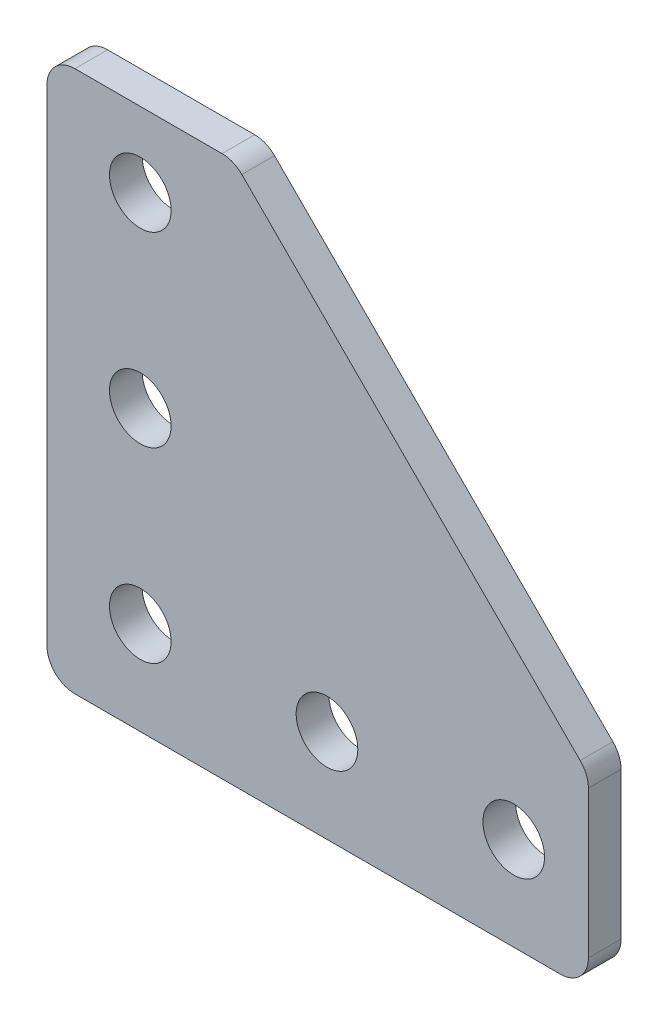
ISO-10303-21;
HEADER;
FILE_DESCRIPTION(('STEP AP214'),'2;1');
FILE_NAME('part.step','',(''),(''),'','','');
FILE_SCHEMA(('AUTOMOTIVE_DESIGN { 1 0 10303 214 1 1 1 1 }'));
ENDSEC;
DATA;
#1=APPLICATION_CONTEXT('core data for automotive mechanical design processes');
#2=APPLICATION_PROTOCOL_DEFINITION('international standard','automotive_design',2000,#1);
#3=PRODUCT_CONTEXT('',#1,'mechanical');
#4=PRODUCT('Part','Part','',(#3));
#5=PRODUCT_RELATED_PRODUCT_CATEGORY('part','',(#4));
#6=PRODUCT_DEFINITION_FORMATION('','',#4);
#7=PRODUCT_DEFINITION_CONTEXT('part definition',#1,'design');
#8=PRODUCT_DEFINITION('design','',#6,#7);
#9=PRODUCT_DEFINITION_SHAPE('','',#8);
#10=(LENGTH_UNIT() NAMED_UNIT(*) SI_UNIT(.MILLI.,.METRE.));
#11=(NAMED_UNIT(*) PLANE_ANGLE_UNIT() SI_UNIT($,.RADIAN.));
#12=(NAMED_UNIT(*) SI_UNIT($,.STERADIAN.) SOLID_ANGLE_UNIT());
#13=UNCERTAINTY_MEASURE_WITH_UNIT(LENGTH_MEASURE(1.E-05),#10,'distance_accuracy_value','');
#14=(GEOMETRIC_REPRESENTATION_CONTEXT(3) GLOBAL_UNCERTAINTY_ASSIGNED_CONTEXT((#13)) GLOBAL_UNIT_ASSIGNED_CONTEXT((#10,
#11,#12)) REPRESENTATION_CONTEXT('',''));
#15=CARTESIAN_POINT('',(0.,0.,0.));
#16=DIRECTION('',(0.,0.,1.));
#17=DIRECTION('',(1.,0.,0.));
#18=AXIS2_PLACEMENT_3D('',#15,#16,#17);
#19=CARTESIAN_POINT('',(29.,0.,1.75));
#20=DIRECTION('',(1.,0.,0.));
#21=DIRECTION('',(0.,1.,0.));
#22=AXIS2_PLACEMENT_3D('',#19,#20,#21);
#23=PLANE('',#22);
#24=DIRECTION('',(0.,-1.,0.));
#25=VECTOR('',#24,1.);
#26=CARTESIAN_POINT('',(29.,0.,-1.75));
#27=LINE('',#26,#25);
#28=CARTESIAN_POINT('',(29.,-10.2426406871193,-1.75));
#29=VERTEX_POINT('',#28);
#30=CARTESIAN_POINT('',(29.,-26.,-1.75));
#31=VERTEX_POINT('',#30);
#32=EDGE_CURVE('E185',#29,#31,#27,.T.);
#33=ORIENTED_EDGE('',*,*,#32,.F.);
#34=DIRECTION('',(0.,0.,-1.));
#35=VECTOR('',#34,1.);
#36=CARTESIAN_POINT('',(29.,-10.2426406871193,1.75));
#37=LINE('',#36,#35);
#38=CARTESIAN_POINT('',(29.,-10.2426406871193,1.75));
#39=VERTEX_POINT('',#38);
#40=EDGE_CURVE('E170',#29,#39,#37,.F.);
#41=ORIENTED_EDGE('',*,*,#40,.T.);
#42=DIRECTION('',(0.,-1.,0.));
#43=VECTOR('',#42,1.);
#44=CARTESIAN_POINT('',(29.,0.,1.75));
#45=LINE('',#44,#43);
#46=CARTESIAN_POINT('',(29.,-26.,1.75));
#47=VERTEX_POINT('',#46);
#48=EDGE_CURVE('E190',#39,#47,#45,.T.);
#49=ORIENTED_EDGE('',*,*,#48,.T.);
#50=DIRECTION('',(0.,0.,-1.));
#51=VECTOR('',#50,1.);
#52=CARTESIAN_POINT('',(29.,-26.,-1.75));
#53=LINE('',#52,#51);
#54=EDGE_CURVE('E167',#47,#31,#53,.T.);
#55=ORIENTED_EDGE('',*,*,#54,.T.);
#56=EDGE_LOOP('',(#33,#41,#49,#55));
#57=FACE_BOUND('',#56,.T.);
#58=ADVANCED_FACE('F36',(#57),#23,.T.);
#59=CARTESIAN_POINT('',(10.,10.,1.75));
#60=DIRECTION('',(0.707106781186547,0.707106781186547,0.));
#61=DIRECTION('',(-0.707106781186548,0.707106781186548,0.));
#62=AXIS2_PLACEMENT_3D('',#59,#60,#61);
#63=PLANE('',#62);
#64=DIRECTION('',(0.707106781186548,-0.707106781186548,0.));
#65=VECTOR('',#64,1.);
#66=CARTESIAN_POINT('',(10.,10.,-1.75));
#67=LINE('',#66,#65);
#68=CARTESIAN_POINT('',(-8.12132034355965,28.1213203435597,-1.75));
#69=VERTEX_POINT('',#68);
#70=CARTESIAN_POINT('',(28.1213203435597,-8.12132034355964,-1.75));
#71=VERTEX_POINT('',#70);
#72=EDGE_CURVE('E134',#69,#71,#67,.T.);
#73=ORIENTED_EDGE('',*,*,#72,.F.);
#74=DIRECTION('',(0.,0.,-1.));
#75=VECTOR('',#74,1.);
#76=CARTESIAN_POINT('',(-8.12132034355964,28.1213203435597,1.75));
#77=LINE('',#76,#75);
#78=CARTESIAN_POINT('',(-8.12132034355965,28.1213203435597,1.75));
#79=VERTEX_POINT('',#78);
#80=EDGE_CURVE('E157',#69,#79,#77,.F.);
#81=ORIENTED_EDGE('',*,*,#80,.T.);
#82=DIRECTION('',(0.707106781186548,-0.707106781186548,0.));
#83=VECTOR('',#82,1.);
#84=CARTESIAN_POINT('',(10.,10.,1.75));
#85=LINE('',#84,#83);
#86=CARTESIAN_POINT('',(28.1213203435597,-8.12132034355964,1.75));
#87=VERTEX_POINT('',#86);
#88=EDGE_CURVE('E181',#79,#87,#85,.T.);
#89=ORIENTED_EDGE('',*,*,#88,.T.);
#90=DIRECTION('',(0.,0.,-1.));
#91=VECTOR('',#90,1.);
#92=CARTESIAN_POINT('',(28.1213203435597,-8.12132034355963,1.75));
#93=LINE('',#92,#91);
#94=EDGE_CURVE('E154',#87,#71,#93,.T.);
#95=ORIENTED_EDGE('',*,*,#94,.T.);
#96=EDGE_LOOP('',(#73,#81,#89,#95));
#97=FACE_BOUND('',#96,.T.);
#98=ADVANCED_FACE('F259',(#97),#63,.T.);
#99=CARTESIAN_POINT('',(0.,29.,1.75));
#100=DIRECTION('',(0.,1.,0.));
#101=DIRECTION('',(0.,0.,1.));
#102=AXIS2_PLACEMENT_3D('',#99,#100,#101);
#103=PLANE('',#102);
#104=DIRECTION('',(1.,0.,0.));
#105=VECTOR('',#104,1.);
#106=CARTESIAN_POINT('',(0.,29.,1.75));
#107=LINE('',#106,#105);
#108=CARTESIAN_POINT('',(-26.,29.,1.75));
#109=VERTEX_POINT('',#108);
#110=CARTESIAN_POINT('',(-10.2426406871193,29.,1.75));
#111=VERTEX_POINT('',#110);
#112=EDGE_CURVE('E179',#109,#111,#107,.T.);
#113=ORIENTED_EDGE('',*,*,#112,.T.);
#114=DIRECTION('',(0.,0.,-1.));
#115=VECTOR('',#114,1.);
#116=CARTESIAN_POINT('',(-10.2426406871193,29.,1.75));
#117=LINE('',#116,#115);
#118=CARTESIAN_POINT('',(-10.2426406871193,29.,-1.75));
#119=VERTEX_POINT('',#118);
#120=EDGE_CURVE('E125',#111,#119,#117,.T.);
#121=ORIENTED_EDGE('',*,*,#120,.T.);
#122=DIRECTION('',(1.,0.,0.));
#123=VECTOR('',#122,1.);
#124=CARTESIAN_POINT('',(0.,29.,-1.75));
#125=LINE('',#124,#123);
#126=CARTESIAN_POINT('',(-26.,29.,-1.75));
#127=VERTEX_POINT('',#126);
#128=EDGE_CURVE('E117',#127,#119,#125,.T.);
#129=ORIENTED_EDGE('',*,*,#128,.F.);
#130=DIRECTION('',(0.,0.,-1.));
#131=VECTOR('',#130,1.);
#132=CARTESIAN_POINT('',(-26.,29.,1.75));
#133=LINE('',#132,#131);
#134=EDGE_CURVE('E131',#127,#109,#133,.F.);
#135=ORIENTED_EDGE('',*,*,#134,.T.);
#136=EDGE_LOOP('',(#113,#121,#129,#135));
#137=FACE_BOUND('',#136,.T.);
#138=ADVANCED_FACE('F130',(#137),#103,.T.);
#139=CARTESIAN_POINT('',(-29.,0.,1.75));
#140=DIRECTION('',(1.,0.,0.));
#141=DIRECTION('',(0.,1.,0.));
#142=AXIS2_PLACEMENT_3D('',#139,#140,#141);
#143=PLANE('',#142);
#144=DIRECTION('',(0.,-1.,0.));
#145=VECTOR('',#144,1.);
#146=CARTESIAN_POINT('',(-29.,0.,-1.75));
#147=LINE('',#146,#145);
#148=CARTESIAN_POINT('',(-29.,26.,-1.75));
#149=VERTEX_POINT('',#148);
#150=CARTESIAN_POINT('',(-29.,-26.,-1.75));
#151=VERTEX_POINT('',#150);
#152=EDGE_CURVE('E119',#149,#151,#147,.T.);
#153=ORIENTED_EDGE('',*,*,#152,.T.);
#154=DIRECTION('',(0.,0.,-1.));
#155=VECTOR('',#154,1.);
#156=CARTESIAN_POINT('',(-29.,-26.,1.75));
#157=LINE('',#156,#155);
#158=CARTESIAN_POINT('',(-29.,-26.,1.75));
#159=VERTEX_POINT('',#158);
#160=EDGE_CURVE('E11',#151,#159,#157,.F.);
#161=ORIENTED_EDGE('',*,*,#160,.T.);
#162=DIRECTION('',(0.,-1.,0.));
#163=VECTOR('',#162,1.);
#164=CARTESIAN_POINT('',(-29.,0.,1.75));
#165=LINE('',#164,#163);
#166=CARTESIAN_POINT('',(-29.,26.,1.75));
#167=VERTEX_POINT('',#166);
#168=EDGE_CURVE('E141',#167,#159,#165,.T.);
#169=ORIENTED_EDGE('',*,*,#168,.F.);
#170=DIRECTION('',(0.,0.,-1.));
#171=VECTOR('',#170,1.);
#172=CARTESIAN_POINT('',(-29.,26.,-1.75));
#173=LINE('',#172,#171);
#174=EDGE_CURVE('E44',#167,#149,#173,.T.);
#175=ORIENTED_EDGE('',*,*,#174,.T.);
#176=EDGE_LOOP('',(#153,#161,#169,#175));
#177=FACE_BOUND('',#176,.T.);
#178=ADVANCED_FACE('F177',(#177),#143,.F.);
#179=CARTESIAN_POINT('',(0.,-29.,1.75));
#180=DIRECTION('',(0.,1.,0.));
#181=DIRECTION('',(0.,0.,1.));
#182=AXIS2_PLACEMENT_3D('',#179,#180,#181);
#183=PLANE('',#182);
#184=DIRECTION('',(1.,0.,0.));
#185=VECTOR('',#184,1.);
#186=CARTESIAN_POINT('',(0.,-29.,-1.75));
#187=LINE('',#186,#185);
#188=CARTESIAN_POINT('',(-26.,-29.,-1.75));
#189=VERTEX_POINT('',#188);
#190=CARTESIAN_POINT('',(26.,-29.,-1.75));
#191=VERTEX_POINT('',#190);
#192=EDGE_CURVE('E144',#189,#191,#187,.T.);
#193=ORIENTED_EDGE('',*,*,#192,.T.);
#194=DIRECTION('',(0.,0.,-1.));
#195=VECTOR('',#194,1.);
#196=CARTESIAN_POINT('',(26.,-29.,1.75));
#197=LINE('',#196,#195);
#198=CARTESIAN_POINT('',(26.,-29.,1.75));
#199=VERTEX_POINT('',#198);
#200=EDGE_CURVE('E51',#191,#199,#197,.F.);
#201=ORIENTED_EDGE('',*,*,#200,.T.);
#202=DIRECTION('',(1.,0.,0.));
#203=VECTOR('',#202,1.);
#204=CARTESIAN_POINT('',(0.,-29.,1.75));
#205=LINE('',#204,#203);
#206=CARTESIAN_POINT('',(-26.,-29.,1.75));
#207=VERTEX_POINT('',#206);
#208=EDGE_CURVE('E138',#207,#199,#205,.T.);
#209=ORIENTED_EDGE('',*,*,#208,.F.);
#210=DIRECTION('',(0.,0.,-1.));
#211=VECTOR('',#210,1.);
#212=CARTESIAN_POINT('',(-26.,-29.,1.75));
#213=LINE('',#212,#211);
#214=EDGE_CURVE('E172',#207,#189,#213,.T.);
#215=ORIENTED_EDGE('',*,*,#214,.T.);
#216=EDGE_LOOP('',(#193,#201,#209,#215));
#217=FACE_BOUND('',#216,.T.);
#218=ADVANCED_FACE('F242',(#217),#183,.F.);
#219=CARTESIAN_POINT('',(0.,0.,1.75));
#220=DIRECTION('',(0.,0.,1.));
#221=DIRECTION('',(1.,0.,0.));
#222=AXIS2_PLACEMENT_3D('',#219,#220,#221);
#223=PLANE('',#222);
#224=CARTESIAN_POINT('',(0.999999999999994,-19.,1.75));
#225=DIRECTION('',(0.,0.,1.));
#226=DIRECTION('',(1.,0.,0.));
#227=AXIS2_PLACEMENT_3D('',#224,#225,#226);
#228=CIRCLE('',#227,3.3);
#229=CARTESIAN_POINT('',(4.29999999999999,-19.,1.75));
#230=VERTEX_POINT('',#229);
#231=EDGE_CURVE('E223',#230,#230,#228,.T.);
#232=ORIENTED_EDGE('',*,*,#231,.F.);
#233=EDGE_LOOP('',(#232));
#234=FACE_BOUND('',#233,.T.);
#235=CARTESIAN_POINT('',(21.,-19.,1.75));
#236=DIRECTION('',(0.,0.,1.));
#237=DIRECTION('',(1.,0.,0.));
#238=AXIS2_PLACEMENT_3D('',#235,#236,#237);
#239=CIRCLE('',#238,3.3);
#240=CARTESIAN_POINT('',(24.3,-19.,1.75));
#241=VERTEX_POINT('',#240);
#242=EDGE_CURVE('E217',#241,#241,#239,.T.);
#243=ORIENTED_EDGE('',*,*,#242,.F.);
#244=EDGE_LOOP('',(#243));
#245=FACE_BOUND('',#244,.T.);
#246=CARTESIAN_POINT('',(-19.0000000000001,1.00000000000001,1.75));
#247=DIRECTION('',(0.,0.,1.));
#248=DIRECTION('',(1.,0.,0.));
#249=AXIS2_PLACEMENT_3D('',#246,#247,#248);
#250=CIRCLE('',#249,3.3);
#251=CARTESIAN_POINT('',(-15.7000000000001,1.00000000000001,1.75));
#252=VERTEX_POINT('',#251);
#253=EDGE_CURVE('E211',#252,#252,#250,.T.);
#254=ORIENTED_EDGE('',*,*,#253,.F.);
#255=EDGE_LOOP('',(#254));
#256=FACE_BOUND('',#255,.T.);
#257=CARTESIAN_POINT('',(-19.0000000000001,21.,1.75));
#258=DIRECTION('',(0.,0.,1.));
#259=DIRECTION('',(1.,0.,0.));
#260=AXIS2_PLACEMENT_3D('',#257,#258,#259);
#261=CIRCLE('',#260,3.3);
#262=CARTESIAN_POINT('',(-15.7000000000001,21.,1.75));
#263=VERTEX_POINT('',#262);
#264=EDGE_CURVE('E205',#263,#263,#261,.T.);
#265=ORIENTED_EDGE('',*,*,#264,.F.);
#266=EDGE_LOOP('',(#265));
#267=FACE_BOUND('',#266,.T.);
#268=CARTESIAN_POINT('',(-19.,-19.,1.75));
#269=DIRECTION('',(0.,0.,1.));
#270=DIRECTION('',(1.,0.,0.));
#271=AXIS2_PLACEMENT_3D('',#268,#269,#270);
#272=CIRCLE('',#271,3.3);
#273=CARTESIAN_POINT('',(-15.7,-19.,1.75));
#274=VERTEX_POINT('',#273);
#275=EDGE_CURVE('E199',#274,#274,#272,.T.);
#276=ORIENTED_EDGE('',*,*,#275,.F.);
#277=EDGE_LOOP('',(#276));
#278=FACE_BOUND('',#277,.T.);
#279=ORIENTED_EDGE('',*,*,#88,.F.);
#280=CARTESIAN_POINT('',(-10.2426406871193,26.,1.75));
#281=DIRECTION('',(0.,0.,1.));
#282=DIRECTION('',(1.,0.,0.));
#283=AXIS2_PLACEMENT_3D('',#280,#281,#282);
#284=CIRCLE('',#283,3.);
#285=EDGE_CURVE('E165',#79,#111,#284,.T.);
#286=ORIENTED_EDGE('',*,*,#285,.T.);
#287=ORIENTED_EDGE('',*,*,#112,.F.);
#288=CARTESIAN_POINT('',(-26.,26.,1.75));
#289=DIRECTION('',(0.,0.,1.));
#290=DIRECTION('',(1.,0.,0.));
#291=AXIS2_PLACEMENT_3D('',#288,#289,#290);
#292=CIRCLE('',#291,3.);
#293=EDGE_CURVE('E137',#109,#167,#292,.T.);
#294=ORIENTED_EDGE('',*,*,#293,.T.);
#295=ORIENTED_EDGE('',*,*,#168,.T.);
#296=CARTESIAN_POINT('',(-26.,-26.,1.75));
#297=DIRECTION('',(0.,0.,1.));
#298=DIRECTION('',(1.,0.,0.));
#299=AXIS2_PLACEMENT_3D('',#296,#297,#298);
#300=CIRCLE('',#299,3.);
#301=EDGE_CURVE('E58',#159,#207,#300,.T.);
#302=ORIENTED_EDGE('',*,*,#301,.T.);
#303=ORIENTED_EDGE('',*,*,#208,.T.);
#304=CARTESIAN_POINT('',(26.,-26.,1.75));
#305=DIRECTION('',(0.,0.,1.));
#306=DIRECTION('',(1.,0.,0.));
#307=AXIS2_PLACEMENT_3D('',#304,#305,#306);
#308=CIRCLE('',#307,3.);
#309=EDGE_CURVE('E161',#199,#47,#308,.T.);
#310=ORIENTED_EDGE('',*,*,#309,.T.);
#311=ORIENTED_EDGE('',*,*,#48,.F.);
#312=CARTESIAN_POINT('',(26.,-10.2426406871193,1.75));
#313=DIRECTION('',(0.,0.,1.));
#314=DIRECTION('',(1.,0.,0.));
#315=AXIS2_PLACEMENT_3D('',#312,#313,#314);
#316=CIRCLE('',#315,3.);
#317=EDGE_CURVE('E163',#39,#87,#316,.T.);
#318=ORIENTED_EDGE('',*,*,#317,.T.);
#319=EDGE_LOOP('',(#279,#286,#287,#294,#295,#302,#303,#310,#311,#318));
#320=FACE_BOUND('',#319,.T.);
#321=ADVANCED_FACE('F239',(#234,#245,#256,#267,#278,#320),#223,.T.);
#322=CARTESIAN_POINT('',(0.,0.,-1.75));
#323=DIRECTION('',(0.,0.,1.));
#324=DIRECTION('',(1.,0.,0.));
#325=AXIS2_PLACEMENT_3D('',#322,#323,#324);
#326=PLANE('',#325);
#327=CARTESIAN_POINT('',(0.999999999999994,-19.,-1.75));
#328=DIRECTION('',(0.,0.,1.));
#329=DIRECTION('',(1.,0.,0.));
#330=AXIS2_PLACEMENT_3D('',#327,#328,#329);
#331=CIRCLE('',#330,3.3);
#332=CARTESIAN_POINT('',(4.29999999999999,-19.,-1.75));
#333=VERTEX_POINT('',#332);
#334=EDGE_CURVE('E202',#333,#333,#331,.T.);
#335=ORIENTED_EDGE('',*,*,#334,.T.);
#336=EDGE_LOOP('',(#335));
#337=FACE_BOUND('',#336,.T.);
#338=CARTESIAN_POINT('',(21.,-19.,-1.75));
#339=DIRECTION('',(0.,0.,1.));
#340=DIRECTION('',(1.,0.,0.));
#341=AXIS2_PLACEMENT_3D('',#338,#339,#340);
#342=CIRCLE('',#341,3.3);
#343=CARTESIAN_POINT('',(24.3,-19.,-1.75));
#344=VERTEX_POINT('',#343);
#345=EDGE_CURVE('E220',#344,#344,#342,.T.);
#346=ORIENTED_EDGE('',*,*,#345,.T.);
#347=EDGE_LOOP('',(#346));
#348=FACE_BOUND('',#347,.T.);
#349=CARTESIAN_POINT('',(-19.0000000000001,1.00000000000001,-1.75));
#350=DIRECTION('',(0.,0.,1.));
#351=DIRECTION('',(1.,0.,0.));
#352=AXIS2_PLACEMENT_3D('',#349,#350,#351);
#353=CIRCLE('',#352,3.3);
#354=CARTESIAN_POINT('',(-15.7000000000001,1.00000000000001,-1.75));
#355=VERTEX_POINT('',#354);
#356=EDGE_CURVE('E214',#355,#355,#353,.T.);
#357=ORIENTED_EDGE('',*,*,#356,.T.);
#358=EDGE_LOOP('',(#357));
#359=FACE_BOUND('',#358,.T.);
#360=CARTESIAN_POINT('',(-19.0000000000001,21.,-1.75));
#361=DIRECTION('',(0.,0.,1.));
#362=DIRECTION('',(1.,0.,0.));
#363=AXIS2_PLACEMENT_3D('',#360,#361,#362);
#364=CIRCLE('',#363,3.3);
#365=CARTESIAN_POINT('',(-15.7000000000001,21.,-1.75));
#366=VERTEX_POINT('',#365);
#367=EDGE_CURVE('E208',#366,#366,#364,.T.);
#368=ORIENTED_EDGE('',*,*,#367,.T.);
#369=EDGE_LOOP('',(#368));
#370=FACE_BOUND('',#369,.T.);
#371=CARTESIAN_POINT('',(-19.,-19.,-1.75));
#372=DIRECTION('',(0.,0.,1.));
#373=DIRECTION('',(1.,0.,0.));
#374=AXIS2_PLACEMENT_3D('',#371,#372,#373);
#375=CIRCLE('',#374,3.3);
#376=CARTESIAN_POINT('',(-15.7,-19.,-1.75));
#377=VERTEX_POINT('',#376);
#378=EDGE_CURVE('E188',#377,#377,#375,.T.);
#379=ORIENTED_EDGE('',*,*,#378,.T.);
#380=EDGE_LOOP('',(#379));
#381=FACE_BOUND('',#380,.T.);
#382=ORIENTED_EDGE('',*,*,#128,.T.);
#383=CARTESIAN_POINT('',(-10.2426406871193,26.,-1.75));
#384=DIRECTION('',(0.,0.,1.));
#385=DIRECTION('',(1.,0.,0.));
#386=AXIS2_PLACEMENT_3D('',#383,#384,#385);
#387=CIRCLE('',#386,3.);
#388=EDGE_CURVE('E152',#119,#69,#387,.F.);
#389=ORIENTED_EDGE('',*,*,#388,.T.);
#390=ORIENTED_EDGE('',*,*,#72,.T.);
#391=CARTESIAN_POINT('',(26.,-10.2426406871193,-1.75));
#392=DIRECTION('',(0.,0.,1.));
#393=DIRECTION('',(1.,0.,0.));
#394=AXIS2_PLACEMENT_3D('',#391,#392,#393);
#395=CIRCLE('',#394,3.);
#396=EDGE_CURVE('E150',#71,#29,#395,.F.);
#397=ORIENTED_EDGE('',*,*,#396,.T.);
#398=ORIENTED_EDGE('',*,*,#32,.T.);
#399=CARTESIAN_POINT('',(26.,-26.,-1.75));
#400=DIRECTION('',(0.,0.,1.));
#401=DIRECTION('',(1.,0.,0.));
#402=AXIS2_PLACEMENT_3D('',#399,#400,#401);
#403=CIRCLE('',#402,3.);
#404=EDGE_CURVE('E148',#31,#191,#403,.F.);
#405=ORIENTED_EDGE('',*,*,#404,.T.);
#406=ORIENTED_EDGE('',*,*,#192,.F.);
#407=CARTESIAN_POINT('',(-26.,-26.,-1.75));
#408=DIRECTION('',(0.,0.,1.));
#409=DIRECTION('',(1.,0.,0.));
#410=AXIS2_PLACEMENT_3D('',#407,#408,#409);
#411=CIRCLE('',#410,3.);
#412=EDGE_CURVE('E124',#189,#151,#411,.F.);
#413=ORIENTED_EDGE('',*,*,#412,.T.);
#414=ORIENTED_EDGE('',*,*,#152,.F.);
#415=CARTESIAN_POINT('',(-26.,26.,-1.75));
#416=DIRECTION('',(0.,0.,1.));
#417=DIRECTION('',(1.,0.,0.));
#418=AXIS2_PLACEMENT_3D('',#415,#416,#417);
#419=CIRCLE('',#418,3.);
#420=EDGE_CURVE('E114',#149,#127,#419,.F.);
#421=ORIENTED_EDGE('',*,*,#420,.T.);
#422=EDGE_LOOP('',(#382,#389,#390,#397,#398,#405,#406,#413,#414,#421));
#423=FACE_BOUND('',#422,.T.);
#424=ADVANCED_FACE('F116',(#337,#348,#359,#370,#381,#423),#326,.F.);
#425=CARTESIAN_POINT('',(-19.,-19.,-1.75));
#426=DIRECTION('',(0.,0.,1.));
#427=DIRECTION('',(1.,0.,0.));
#428=AXIS2_PLACEMENT_3D('',#425,#426,#427);
#429=CYLINDRICAL_SURFACE('',#428,3.3);
#430=ORIENTED_EDGE('',*,*,#378,.F.);
#431=EDGE_LOOP('',(#430));
#432=FACE_BOUND('',#431,.T.);
#433=ORIENTED_EDGE('',*,*,#275,.T.);
#434=EDGE_LOOP('',(#433));
#435=FACE_BOUND('',#434,.T.);
#436=ADVANCED_FACE('F328',(#432,#435),#429,.F.);
#437=CARTESIAN_POINT('',(-19.0000000000001,21.,-1.75));
#438=DIRECTION('',(0.,0.,1.));
#439=DIRECTION('',(1.,0.,0.));
#440=AXIS2_PLACEMENT_3D('',#437,#438,#439);
#441=CYLINDRICAL_SURFACE('',#440,3.3);
#442=ORIENTED_EDGE('',*,*,#367,.F.);
#443=EDGE_LOOP('',(#442));
#444=FACE_BOUND('',#443,.T.);
#445=ORIENTED_EDGE('',*,*,#264,.T.);
#446=EDGE_LOOP('',(#445));
#447=FACE_BOUND('',#446,.T.);
#448=ADVANCED_FACE('F386',(#444,#447),#441,.F.);
#449=CARTESIAN_POINT('',(-19.0000000000001,1.00000000000001,-1.75));
#450=DIRECTION('',(0.,0.,1.));
#451=DIRECTION('',(1.,0.,0.));
#452=AXIS2_PLACEMENT_3D('',#449,#450,#451);
#453=CYLINDRICAL_SURFACE('',#452,3.3);
#454=ORIENTED_EDGE('',*,*,#356,.F.);
#455=EDGE_LOOP('',(#454));
#456=FACE_BOUND('',#455,.T.);
#457=ORIENTED_EDGE('',*,*,#253,.T.);
#458=EDGE_LOOP('',(#457));
#459=FACE_BOUND('',#458,.T.);
#460=ADVANCED_FACE('F376',(#456,#459),#453,.F.);
#461=CARTESIAN_POINT('',(21.,-19.,-1.75));
#462=DIRECTION('',(0.,0.,1.));
#463=DIRECTION('',(1.,0.,0.));
#464=AXIS2_PLACEMENT_3D('',#461,#462,#463);
#465=CYLINDRICAL_SURFACE('',#464,3.3);
#466=ORIENTED_EDGE('',*,*,#345,.F.);
#467=EDGE_LOOP('',(#466));
#468=FACE_BOUND('',#467,.T.);
#469=ORIENTED_EDGE('',*,*,#242,.T.);
#470=EDGE_LOOP('',(#469));
#471=FACE_BOUND('',#470,.T.);
#472=ADVANCED_FACE('F235',(#468,#471),#465,.F.);
#473=CARTESIAN_POINT('',(0.999999999999994,-19.,-1.75));
#474=DIRECTION('',(0.,0.,1.));
#475=DIRECTION('',(1.,0.,0.));
#476=AXIS2_PLACEMENT_3D('',#473,#474,#475);
#477=CYLINDRICAL_SURFACE('',#476,3.3);
#478=ORIENTED_EDGE('',*,*,#334,.F.);
#479=EDGE_LOOP('',(#478));
#480=FACE_BOUND('',#479,.T.);
#481=ORIENTED_EDGE('',*,*,#231,.T.);
#482=EDGE_LOOP('',(#481));
#483=FACE_BOUND('',#482,.T.);
#484=ADVANCED_FACE('F231',(#480,#483),#477,.F.);
#485=CARTESIAN_POINT('',(-10.2426406871193,26.,1.75));
#486=DIRECTION('',(0.,0.,-1.));
#487=DIRECTION('',(-1.,0.,0.));
#488=AXIS2_PLACEMENT_3D('',#485,#486,#487);
#489=CYLINDRICAL_SURFACE('',#488,3.);
#490=ORIENTED_EDGE('',*,*,#285,.F.);
#491=ORIENTED_EDGE('',*,*,#80,.F.);
#492=ORIENTED_EDGE('',*,*,#388,.F.);
#493=ORIENTED_EDGE('',*,*,#120,.F.);
#494=EDGE_LOOP('',(#490,#491,#492,#493));
#495=FACE_BOUND('',#494,.T.);
#496=ADVANCED_FACE('F234',(#495),#489,.T.);
#497=CARTESIAN_POINT('',(26.,-10.2426406871193,1.75));
#498=DIRECTION('',(0.,0.,-1.));
#499=DIRECTION('',(-1.,0.,0.));
#500=AXIS2_PLACEMENT_3D('',#497,#498,#499);
#501=CYLINDRICAL_SURFACE('',#500,3.);
#502=ORIENTED_EDGE('',*,*,#317,.F.);
#503=ORIENTED_EDGE('',*,*,#40,.F.);
#504=ORIENTED_EDGE('',*,*,#396,.F.);
#505=ORIENTED_EDGE('',*,*,#94,.F.);
#506=EDGE_LOOP('',(#502,#503,#504,#505));
#507=FACE_BOUND('',#506,.T.);
#508=ADVANCED_FACE('F261',(#507),#501,.T.);
#509=CARTESIAN_POINT('',(26.,-26.,1.75));
#510=DIRECTION('',(0.,0.,1.));
#511=DIRECTION('',(1.,0.,0.));
#512=AXIS2_PLACEMENT_3D('',#509,#510,#511);
#513=CYLINDRICAL_SURFACE('',#512,3.);
#514=ORIENTED_EDGE('',*,*,#309,.F.);
#515=ORIENTED_EDGE('',*,*,#200,.F.);
#516=ORIENTED_EDGE('',*,*,#404,.F.);
#517=ORIENTED_EDGE('',*,*,#54,.F.);
#518=EDGE_LOOP('',(#514,#515,#516,#517));
#519=FACE_BOUND('',#518,.T.);
#520=ADVANCED_FACE('F266',(#519),#513,.T.);
#521=CARTESIAN_POINT('',(-26.,-26.,1.75));
#522=DIRECTION('',(0.,0.,-1.));
#523=DIRECTION('',(-1.,0.,0.));
#524=AXIS2_PLACEMENT_3D('',#521,#522,#523);
#525=CYLINDRICAL_SURFACE('',#524,3.);
#526=ORIENTED_EDGE('',*,*,#301,.F.);
#527=ORIENTED_EDGE('',*,*,#160,.F.);
#528=ORIENTED_EDGE('',*,*,#412,.F.);
#529=ORIENTED_EDGE('',*,*,#214,.F.);
#530=EDGE_LOOP('',(#526,#527,#528,#529));
#531=FACE_BOUND('',#530,.T.);
#532=ADVANCED_FACE('F269',(#531),#525,.T.);
#533=CARTESIAN_POINT('',(-26.,26.,1.75));
#534=DIRECTION('',(0.,0.,1.));
#535=DIRECTION('',(1.,0.,0.));
#536=AXIS2_PLACEMENT_3D('',#533,#534,#535);
#537=CYLINDRICAL_SURFACE('',#536,3.);
#538=ORIENTED_EDGE('',*,*,#293,.F.);
#539=ORIENTED_EDGE('',*,*,#134,.F.);
#540=ORIENTED_EDGE('',*,*,#420,.F.);
#541=ORIENTED_EDGE('',*,*,#174,.F.);
#542=EDGE_LOOP('',(#538,#539,#540,#541));
#543=FACE_BOUND('',#542,.T.);
#544=ADVANCED_FACE('F38',(#543),#537,.T.);
#545=CLOSED_SHELL('',(#58,#98,#138,#178,#218,#321,#424,#436,#448,#460,#472,#484,#496,#508,#520,
#532,#544));
#546=MANIFOLD_SOLID_BREP('B2',#545);
#547=ADVANCED_BREP_SHAPE_REPRESENTATION('',(#18,#546),#14);
#548=SHAPE_DEFINITION_REPRESENTATION(#9,#547);
ENDSEC;
END-ISO-10303-21;
